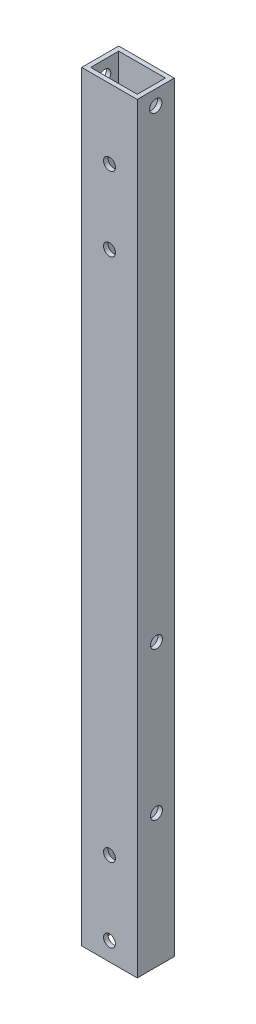
ISO-10303-21;
HEADER;
FILE_DESCRIPTION(('STEP AP214'),'2;1');
FILE_NAME('part.step','',(''),(''),'','','');
FILE_SCHEMA(('AUTOMOTIVE_DESIGN { 1 0 10303 214 1 1 1 1 }'));
ENDSEC;
DATA;
#1=APPLICATION_CONTEXT('core data for automotive mechanical design processes');
#2=APPLICATION_PROTOCOL_DEFINITION('international standard','automotive_design',2000,#1);
#3=PRODUCT_CONTEXT('',#1,'mechanical');
#4=PRODUCT('Part','Part','',(#3));
#5=PRODUCT_RELATED_PRODUCT_CATEGORY('part','',(#4));
#6=PRODUCT_DEFINITION_FORMATION('','',#4);
#7=PRODUCT_DEFINITION_CONTEXT('part definition',#1,'design');
#8=PRODUCT_DEFINITION('design','',#6,#7);
#9=PRODUCT_DEFINITION_SHAPE('','',#8);
#10=(LENGTH_UNIT() NAMED_UNIT(*) SI_UNIT(.MILLI.,.METRE.));
#11=(NAMED_UNIT(*) PLANE_ANGLE_UNIT() SI_UNIT($,.RADIAN.));
#12=(NAMED_UNIT(*) SI_UNIT($,.STERADIAN.) SOLID_ANGLE_UNIT());
#13=UNCERTAINTY_MEASURE_WITH_UNIT(LENGTH_MEASURE(1.E-05),#10,'distance_accuracy_value','');
#14=(GEOMETRIC_REPRESENTATION_CONTEXT(3) GLOBAL_UNCERTAINTY_ASSIGNED_CONTEXT((#13)) GLOBAL_UNIT_ASSIGNED_CONTEXT((#10,
#11,#12)) REPRESENTATION_CONTEXT('',''));
#15=CARTESIAN_POINT('',(0.,0.,0.));
#16=DIRECTION('',(0.,0.,1.));
#17=DIRECTION('',(1.,0.,0.));
#18=AXIS2_PLACEMENT_3D('',#15,#16,#17);
#19=CARTESIAN_POINT('',(7.5,110.,-5.));
#20=DIRECTION('',(-1.,0.,0.));
#21=DIRECTION('',(0.,0.,1.));
#22=AXIS2_PLACEMENT_3D('',#19,#20,#21);
#23=PLANE('',#22);
#24=CARTESIAN_POINT('',(7.5,91.5,0.));
#25=DIRECTION('',(-1.,0.,0.));
#26=DIRECTION('',(0.,0.,1.));
#27=AXIS2_PLACEMENT_3D('',#24,#25,#26);
#28=CIRCLE('',#27,1.65);
#29=CARTESIAN_POINT('',(7.5,91.5,1.64999999999995));
#30=VERTEX_POINT('',#29);
#31=EDGE_CURVE('E377',#30,#30,#28,.T.);
#32=ORIENTED_EDGE('',*,*,#31,.T.);
#33=EDGE_LOOP('',(#32));
#34=FACE_BOUND('',#33,.T.);
#35=CARTESIAN_POINT('',(7.5,-34.,-0.200000000000043));
#36=DIRECTION('',(-1.,0.,0.));
#37=DIRECTION('',(0.,0.,1.));
#38=AXIS2_PLACEMENT_3D('',#35,#36,#37);
#39=CIRCLE('',#38,1.6);
#40=CARTESIAN_POINT('',(7.5,-34.,1.39999999999995));
#41=VERTEX_POINT('',#40);
#42=EDGE_CURVE('E219',#41,#41,#39,.T.);
#43=ORIENTED_EDGE('',*,*,#42,.T.);
#44=EDGE_LOOP('',(#43));
#45=FACE_BOUND('',#44,.T.);
#46=CARTESIAN_POINT('',(7.5,-74.,-0.20000000000002));
#47=DIRECTION('',(-1.,0.,0.));
#48=DIRECTION('',(0.,0.,1.));
#49=AXIS2_PLACEMENT_3D('',#46,#47,#48);
#50=CIRCLE('',#49,1.60000000000001);
#51=CARTESIAN_POINT('',(7.5,-74.,1.39999999999999));
#52=VERTEX_POINT('',#51);
#53=EDGE_CURVE('E163',#52,#52,#50,.T.);
#54=ORIENTED_EDGE('',*,*,#53,.T.);
#55=EDGE_LOOP('',(#54));
#56=FACE_BOUND('',#55,.T.);
#57=DIRECTION('',(0.,0.,-1.));
#58=VECTOR('',#57,1.);
#59=CARTESIAN_POINT('',(7.5,95.5,5.));
#60=LINE('',#59,#58);
#61=CARTESIAN_POINT('',(7.5,95.5,5.));
#62=VERTEX_POINT('',#61);
#63=CARTESIAN_POINT('',(7.5,95.5,-5.));
#64=VERTEX_POINT('',#63);
#65=EDGE_CURVE('E111',#62,#64,#60,.T.);
#66=ORIENTED_EDGE('',*,*,#65,.F.);
#67=DIRECTION('',(0.,-1.,0.));
#68=VECTOR('',#67,1.);
#69=CARTESIAN_POINT('',(7.5,110.,5.));
#70=LINE('',#69,#68);
#71=CARTESIAN_POINT('',(7.5,-110.,5.));
#72=VERTEX_POINT('',#71);
#73=EDGE_CURVE('E122',#62,#72,#70,.T.);
#74=ORIENTED_EDGE('',*,*,#73,.T.);
#75=DIRECTION('',(0.,0.,-1.));
#76=VECTOR('',#75,1.);
#77=CARTESIAN_POINT('',(7.5,-110.,-5.));
#78=LINE('',#77,#76);
#79=CARTESIAN_POINT('',(7.5,-110.,-5.));
#80=VERTEX_POINT('',#79);
#81=EDGE_CURVE('E280',#72,#80,#78,.T.);
#82=ORIENTED_EDGE('',*,*,#81,.T.);
#83=DIRECTION('',(0.,-1.,0.));
#84=VECTOR('',#83,1.);
#85=CARTESIAN_POINT('',(7.5,110.,-5.));
#86=LINE('',#85,#84);
#87=EDGE_CURVE('E54',#64,#80,#86,.T.);
#88=ORIENTED_EDGE('',*,*,#87,.F.);
#89=EDGE_LOOP('',(#66,#74,#82,#88));
#90=FACE_BOUND('',#89,.T.);
#91=ADVANCED_FACE('F45',(#34,#45,#56,#90),#23,.F.);
#92=CARTESIAN_POINT('',(-7.5,110.,-5.));
#93=DIRECTION('',(0.,0.,1.));
#94=DIRECTION('',(1.,0.,0.));
#95=AXIS2_PLACEMENT_3D('',#92,#93,#94);
#96=PLANE('',#95);
#97=CARTESIAN_POINT('',(0.,56.66,-5.));
#98=DIRECTION('',(0.,0.,-1.));
#99=DIRECTION('',(-1.,0.,0.));
#100=AXIS2_PLACEMENT_3D('',#97,#98,#99);
#101=CIRCLE('',#100,1.6);
#102=CARTESIAN_POINT('',(-1.6,56.66,-5.));
#103=VERTEX_POINT('',#102);
#104=EDGE_CURVE('E173',#103,#103,#101,.T.);
#105=ORIENTED_EDGE('',*,*,#104,.F.);
#106=EDGE_LOOP('',(#105));
#107=FACE_BOUND('',#106,.T.);
#108=CARTESIAN_POINT('',(0.,76.66,-5.));
#109=DIRECTION('',(0.,0.,-1.));
#110=DIRECTION('',(-1.,0.,0.));
#111=AXIS2_PLACEMENT_3D('',#108,#109,#110);
#112=CIRCLE('',#111,1.6);
#113=CARTESIAN_POINT('',(-1.6,76.66,-5.));
#114=VERTEX_POINT('',#113);
#115=EDGE_CURVE('E390',#114,#114,#112,.T.);
#116=ORIENTED_EDGE('',*,*,#115,.F.);
#117=EDGE_LOOP('',(#116));
#118=FACE_BOUND('',#117,.T.);
#119=CARTESIAN_POINT('',(0.,-105.,-5.));
#120=DIRECTION('',(0.,0.,-1.));
#121=DIRECTION('',(-1.,0.,0.));
#122=AXIS2_PLACEMENT_3D('',#119,#120,#121);
#123=CIRCLE('',#122,1.60000000000001);
#124=CARTESIAN_POINT('',(-1.60000000000001,-105.,-5.));
#125=VERTEX_POINT('',#124);
#126=EDGE_CURVE('E232',#125,#125,#123,.T.);
#127=ORIENTED_EDGE('',*,*,#126,.F.);
#128=EDGE_LOOP('',(#127));
#129=FACE_BOUND('',#128,.T.);
#130=CARTESIAN_POINT('',(0.,-85.,-5.));
#131=DIRECTION('',(0.,0.,-1.));
#132=DIRECTION('',(-1.,0.,0.));
#133=AXIS2_PLACEMENT_3D('',#130,#131,#132);
#134=CIRCLE('',#133,1.6);
#135=CARTESIAN_POINT('',(-1.6,-85.,-5.));
#136=VERTEX_POINT('',#135);
#137=EDGE_CURVE('E151',#136,#136,#134,.T.);
#138=ORIENTED_EDGE('',*,*,#137,.F.);
#139=EDGE_LOOP('',(#138));
#140=FACE_BOUND('',#139,.T.);
#141=DIRECTION('',(-1.,0.,0.));
#142=VECTOR('',#141,1.);
#143=CARTESIAN_POINT('',(7.5,95.5,-5.));
#144=LINE('',#143,#142);
#145=CARTESIAN_POINT('',(-7.5,95.5,-5.));
#146=VERTEX_POINT('',#145);
#147=EDGE_CURVE('E125',#64,#146,#144,.T.);
#148=ORIENTED_EDGE('',*,*,#147,.F.);
#149=ORIENTED_EDGE('',*,*,#87,.T.);
#150=DIRECTION('',(-1.,0.,0.));
#151=VECTOR('',#150,1.);
#152=CARTESIAN_POINT('',(-7.5,-110.,-5.));
#153=LINE('',#152,#151);
#154=CARTESIAN_POINT('',(-7.5,-110.,-5.));
#155=VERTEX_POINT('',#154);
#156=EDGE_CURVE('E283',#80,#155,#153,.T.);
#157=ORIENTED_EDGE('',*,*,#156,.T.);
#158=DIRECTION('',(0.,-1.,0.));
#159=VECTOR('',#158,1.);
#160=CARTESIAN_POINT('',(-7.5,110.,-5.));
#161=LINE('',#160,#159);
#162=EDGE_CURVE('E136',#146,#155,#161,.T.);
#163=ORIENTED_EDGE('',*,*,#162,.F.);
#164=EDGE_LOOP('',(#148,#149,#157,#163));
#165=FACE_BOUND('',#164,.T.);
#166=ADVANCED_FACE('F297',(#107,#118,#129,#140,#165),#96,.F.);
#167=CARTESIAN_POINT('',(-7.5,110.,-5.));
#168=DIRECTION('',(1.,0.,0.));
#169=DIRECTION('',(0.,0.,-1.));
#170=AXIS2_PLACEMENT_3D('',#167,#168,#169);
#171=PLANE('',#170);
#172=CARTESIAN_POINT('',(-7.5,91.5,0.));
#173=DIRECTION('',(-1.,0.,0.));
#174=DIRECTION('',(0.,0.,1.));
#175=AXIS2_PLACEMENT_3D('',#172,#173,#174);
#176=CIRCLE('',#175,1.65);
#177=CARTESIAN_POINT('',(-7.5,91.5,1.64999999999995));
#178=VERTEX_POINT('',#177);
#179=EDGE_CURVE('E379',#178,#178,#176,.T.);
#180=ORIENTED_EDGE('',*,*,#179,.F.);
#181=EDGE_LOOP('',(#180));
#182=FACE_BOUND('',#181,.T.);
#183=CARTESIAN_POINT('',(-7.5,-34.,-0.200000000000042));
#184=DIRECTION('',(-1.,0.,0.));
#185=DIRECTION('',(0.,0.,1.));
#186=AXIS2_PLACEMENT_3D('',#183,#184,#185);
#187=CIRCLE('',#186,1.6);
#188=CARTESIAN_POINT('',(-7.5,-34.,1.39999999999995));
#189=VERTEX_POINT('',#188);
#190=EDGE_CURVE('E211',#189,#189,#187,.T.);
#191=ORIENTED_EDGE('',*,*,#190,.F.);
#192=EDGE_LOOP('',(#191));
#193=FACE_BOUND('',#192,.T.);
#194=CARTESIAN_POINT('',(-7.5,-74.,-0.200000000000019));
#195=DIRECTION('',(-1.,0.,0.));
#196=DIRECTION('',(0.,0.,1.));
#197=AXIS2_PLACEMENT_3D('',#194,#195,#196);
#198=CIRCLE('',#197,1.60000000000001);
#199=CARTESIAN_POINT('',(-7.5,-74.,1.39999999999999));
#200=VERTEX_POINT('',#199);
#201=EDGE_CURVE('E215',#200,#200,#198,.T.);
#202=ORIENTED_EDGE('',*,*,#201,.F.);
#203=EDGE_LOOP('',(#202));
#204=FACE_BOUND('',#203,.T.);
#205=DIRECTION('',(0.,0.,1.));
#206=VECTOR('',#205,1.);
#207=CARTESIAN_POINT('',(-7.5,95.5,-5.));
#208=LINE('',#207,#206);
#209=CARTESIAN_POINT('',(-7.5,95.5,5.));
#210=VERTEX_POINT('',#209);
#211=EDGE_CURVE('E62',#146,#210,#208,.T.);
#212=ORIENTED_EDGE('',*,*,#211,.F.);
#213=ORIENTED_EDGE('',*,*,#162,.T.);
#214=DIRECTION('',(0.,0.,1.));
#215=VECTOR('',#214,1.);
#216=CARTESIAN_POINT('',(-7.5,-110.,-5.));
#217=LINE('',#216,#215);
#218=CARTESIAN_POINT('',(-7.5,-110.,5.));
#219=VERTEX_POINT('',#218);
#220=EDGE_CURVE('E138',#155,#219,#217,.T.);
#221=ORIENTED_EDGE('',*,*,#220,.T.);
#222=DIRECTION('',(0.,-1.,0.));
#223=VECTOR('',#222,1.);
#224=CARTESIAN_POINT('',(-7.5,110.,5.));
#225=LINE('',#224,#223);
#226=EDGE_CURVE('E132',#210,#219,#225,.T.);
#227=ORIENTED_EDGE('',*,*,#226,.F.);
#228=EDGE_LOOP('',(#212,#213,#221,#227));
#229=FACE_BOUND('',#228,.T.);
#230=ADVANCED_FACE('F290',(#182,#193,#204,#229),#171,.F.);
#231=CARTESIAN_POINT('',(-7.5,110.,5.));
#232=DIRECTION('',(0.,0.,-1.));
#233=DIRECTION('',(-1.,0.,0.));
#234=AXIS2_PLACEMENT_3D('',#231,#232,#233);
#235=PLANE('',#234);
#236=CARTESIAN_POINT('',(0.,56.66,5.));
#237=DIRECTION('',(0.,0.,-1.));
#238=DIRECTION('',(-1.,0.,0.));
#239=AXIS2_PLACEMENT_3D('',#236,#237,#238);
#240=CIRCLE('',#239,1.6);
#241=CARTESIAN_POINT('',(-1.6,56.66,5.));
#242=VERTEX_POINT('',#241);
#243=EDGE_CURVE('E117',#242,#242,#240,.T.);
#244=ORIENTED_EDGE('',*,*,#243,.T.);
#245=EDGE_LOOP('',(#244));
#246=FACE_BOUND('',#245,.T.);
#247=CARTESIAN_POINT('',(0.,76.66,5.));
#248=DIRECTION('',(0.,0.,-1.));
#249=DIRECTION('',(-1.,0.,0.));
#250=AXIS2_PLACEMENT_3D('',#247,#248,#249);
#251=CIRCLE('',#250,1.6);
#252=CARTESIAN_POINT('',(-1.6,76.66,5.));
#253=VERTEX_POINT('',#252);
#254=EDGE_CURVE('E178',#253,#253,#251,.T.);
#255=ORIENTED_EDGE('',*,*,#254,.T.);
#256=EDGE_LOOP('',(#255));
#257=FACE_BOUND('',#256,.T.);
#258=CARTESIAN_POINT('',(0.,-105.,5.));
#259=DIRECTION('',(0.,0.,-1.));
#260=DIRECTION('',(-1.,0.,0.));
#261=AXIS2_PLACEMENT_3D('',#258,#259,#260);
#262=CIRCLE('',#261,1.60000000000001);
#263=CARTESIAN_POINT('',(-1.60000000000001,-105.,5.));
#264=VERTEX_POINT('',#263);
#265=EDGE_CURVE('E157',#264,#264,#262,.T.);
#266=ORIENTED_EDGE('',*,*,#265,.T.);
#267=EDGE_LOOP('',(#266));
#268=FACE_BOUND('',#267,.T.);
#269=CARTESIAN_POINT('',(0.,-85.,5.));
#270=DIRECTION('',(0.,0.,-1.));
#271=DIRECTION('',(-1.,0.,0.));
#272=AXIS2_PLACEMENT_3D('',#269,#270,#271);
#273=CIRCLE('',#272,1.6);
#274=CARTESIAN_POINT('',(-1.6,-85.,5.));
#275=VERTEX_POINT('',#274);
#276=EDGE_CURVE('E248',#275,#275,#273,.T.);
#277=ORIENTED_EDGE('',*,*,#276,.T.);
#278=EDGE_LOOP('',(#277));
#279=FACE_BOUND('',#278,.T.);
#280=DIRECTION('',(1.,0.,0.));
#281=VECTOR('',#280,1.);
#282=CARTESIAN_POINT('',(-7.5,95.5,5.));
#283=LINE('',#282,#281);
#284=EDGE_CURVE('E108',#210,#62,#283,.T.);
#285=ORIENTED_EDGE('',*,*,#284,.F.);
#286=ORIENTED_EDGE('',*,*,#226,.T.);
#287=DIRECTION('',(1.,0.,0.));
#288=VECTOR('',#287,1.);
#289=CARTESIAN_POINT('',(-7.5,-110.,5.));
#290=LINE('',#289,#288);
#291=EDGE_CURVE('E129',#219,#72,#290,.T.);
#292=ORIENTED_EDGE('',*,*,#291,.T.);
#293=ORIENTED_EDGE('',*,*,#73,.F.);
#294=EDGE_LOOP('',(#285,#286,#292,#293));
#295=FACE_BOUND('',#294,.T.);
#296=ADVANCED_FACE('F127',(#246,#257,#268,#279,#295),#235,.F.);
#297=CARTESIAN_POINT('',(-6.3,110.,-3.8));
#298=DIRECTION('',(1.,0.,0.));
#299=DIRECTION('',(0.,0.,-1.));
#300=AXIS2_PLACEMENT_3D('',#297,#298,#299);
#301=PLANE('',#300);
#302=CARTESIAN_POINT('',(-6.3,91.5,0.));
#303=DIRECTION('',(1.,0.,0.));
#304=DIRECTION('',(0.,0.,-1.));
#305=AXIS2_PLACEMENT_3D('',#302,#303,#304);
#306=CIRCLE('',#305,1.65);
#307=CARTESIAN_POINT('',(-6.3,91.5,-1.65000000000005));
#308=VERTEX_POINT('',#307);
#309=EDGE_CURVE('E383',#308,#308,#306,.T.);
#310=ORIENTED_EDGE('',*,*,#309,.F.);
#311=EDGE_LOOP('',(#310));
#312=FACE_BOUND('',#311,.T.);
#313=CARTESIAN_POINT('',(-6.3,-74.,-0.200000000000019));
#314=DIRECTION('',(1.,0.,0.));
#315=DIRECTION('',(0.,0.,-1.));
#316=AXIS2_PLACEMENT_3D('',#313,#314,#315);
#317=CIRCLE('',#316,1.60000000000001);
#318=CARTESIAN_POINT('',(-6.3,-74.,-1.80000000000003));
#319=VERTEX_POINT('',#318);
#320=EDGE_CURVE('E167',#319,#319,#317,.T.);
#321=ORIENTED_EDGE('',*,*,#320,.F.);
#322=EDGE_LOOP('',(#321));
#323=FACE_BOUND('',#322,.T.);
#324=CARTESIAN_POINT('',(-6.3,-34.,-0.200000000000042));
#325=DIRECTION('',(1.,0.,0.));
#326=DIRECTION('',(0.,0.,-1.));
#327=AXIS2_PLACEMENT_3D('',#324,#325,#326);
#328=CIRCLE('',#327,1.6);
#329=CARTESIAN_POINT('',(-6.3,-34.,-1.80000000000004));
#330=VERTEX_POINT('',#329);
#331=EDGE_CURVE('E162',#330,#330,#328,.T.);
#332=ORIENTED_EDGE('',*,*,#331,.F.);
#333=EDGE_LOOP('',(#332));
#334=FACE_BOUND('',#333,.T.);
#335=DIRECTION('',(0.,-1.,0.));
#336=VECTOR('',#335,1.);
#337=CARTESIAN_POINT('',(-6.3,110.,-3.8));
#338=LINE('',#337,#336);
#339=CARTESIAN_POINT('',(-6.3,95.5,-3.8));
#340=VERTEX_POINT('',#339);
#341=CARTESIAN_POINT('',(-6.3,-110.,-3.8));
#342=VERTEX_POINT('',#341);
#343=EDGE_CURVE('E268',#340,#342,#338,.T.);
#344=ORIENTED_EDGE('',*,*,#343,.F.);
#345=DIRECTION('',(0.,0.,1.));
#346=VECTOR('',#345,1.);
#347=CARTESIAN_POINT('',(-6.3,95.5,-3.8));
#348=LINE('',#347,#346);
#349=CARTESIAN_POINT('',(-6.3,95.5,3.8));
#350=VERTEX_POINT('',#349);
#351=EDGE_CURVE('E70',#340,#350,#348,.T.);
#352=ORIENTED_EDGE('',*,*,#351,.T.);
#353=DIRECTION('',(0.,-1.,0.));
#354=VECTOR('',#353,1.);
#355=CARTESIAN_POINT('',(-6.3,110.,3.8));
#356=LINE('',#355,#354);
#357=CARTESIAN_POINT('',(-6.3,-110.,3.8));
#358=VERTEX_POINT('',#357);
#359=EDGE_CURVE('E277',#350,#358,#356,.T.);
#360=ORIENTED_EDGE('',*,*,#359,.T.);
#361=DIRECTION('',(0.,0.,1.));
#362=VECTOR('',#361,1.);
#363=CARTESIAN_POINT('',(-6.3,-110.,-3.8));
#364=LINE('',#363,#362);
#365=EDGE_CURVE('E252',#342,#358,#364,.T.);
#366=ORIENTED_EDGE('',*,*,#365,.F.);
#367=EDGE_LOOP('',(#344,#352,#360,#366));
#368=FACE_BOUND('',#367,.T.);
#369=ADVANCED_FACE('F313',(#312,#323,#334,#368),#301,.T.);
#370=CARTESIAN_POINT('',(-6.3,110.,3.8));
#371=DIRECTION('',(0.,0.,-1.));
#372=DIRECTION('',(-1.,0.,0.));
#373=AXIS2_PLACEMENT_3D('',#370,#371,#372);
#374=PLANE('',#373);
#375=CARTESIAN_POINT('',(0.,56.66,3.8));
#376=DIRECTION('',(0.,0.,-1.));
#377=DIRECTION('',(-1.,0.,0.));
#378=AXIS2_PLACEMENT_3D('',#375,#376,#377);
#379=CIRCLE('',#378,1.6);
#380=CARTESIAN_POINT('',(-1.6,56.66,3.8));
#381=VERTEX_POINT('',#380);
#382=EDGE_CURVE('E177',#381,#381,#379,.T.);
#383=ORIENTED_EDGE('',*,*,#382,.F.);
#384=EDGE_LOOP('',(#383));
#385=FACE_BOUND('',#384,.T.);
#386=CARTESIAN_POINT('',(0.,76.66,3.8));
#387=DIRECTION('',(0.,0.,-1.));
#388=DIRECTION('',(-1.,0.,0.));
#389=AXIS2_PLACEMENT_3D('',#386,#387,#388);
#390=CIRCLE('',#389,1.6);
#391=CARTESIAN_POINT('',(-1.6,76.66,3.8));
#392=VERTEX_POINT('',#391);
#393=EDGE_CURVE('E172',#392,#392,#390,.T.);
#394=ORIENTED_EDGE('',*,*,#393,.F.);
#395=EDGE_LOOP('',(#394));
#396=FACE_BOUND('',#395,.T.);
#397=CARTESIAN_POINT('',(0.,-85.,3.8));
#398=DIRECTION('',(0.,0.,-1.));
#399=DIRECTION('',(-1.,0.,0.));
#400=AXIS2_PLACEMENT_3D('',#397,#398,#399);
#401=CIRCLE('',#400,1.6);
#402=CARTESIAN_POINT('',(-1.6,-85.,3.8));
#403=VERTEX_POINT('',#402);
#404=EDGE_CURVE('E156',#403,#403,#401,.T.);
#405=ORIENTED_EDGE('',*,*,#404,.F.);
#406=EDGE_LOOP('',(#405));
#407=FACE_BOUND('',#406,.T.);
#408=CARTESIAN_POINT('',(0.,-105.,3.8));
#409=DIRECTION('',(0.,0.,-1.));
#410=DIRECTION('',(-1.,0.,0.));
#411=AXIS2_PLACEMENT_3D('',#408,#409,#410);
#412=CIRCLE('',#411,1.60000000000001);
#413=CARTESIAN_POINT('',(-1.60000000000001,-105.,3.8));
#414=VERTEX_POINT('',#413);
#415=EDGE_CURVE('E150',#414,#414,#412,.T.);
#416=ORIENTED_EDGE('',*,*,#415,.F.);
#417=EDGE_LOOP('',(#416));
#418=FACE_BOUND('',#417,.T.);
#419=ORIENTED_EDGE('',*,*,#359,.F.);
#420=DIRECTION('',(1.,0.,0.));
#421=VECTOR('',#420,1.);
#422=CARTESIAN_POINT('',(-6.3,95.5,3.8));
#423=LINE('',#422,#421);
#424=CARTESIAN_POINT('',(6.3,95.5,3.8));
#425=VERTEX_POINT('',#424);
#426=EDGE_CURVE('E205',#350,#425,#423,.T.);
#427=ORIENTED_EDGE('',*,*,#426,.T.);
#428=DIRECTION('',(0.,-1.,0.));
#429=VECTOR('',#428,1.);
#430=CARTESIAN_POINT('',(6.3,110.,3.8));
#431=LINE('',#430,#429);
#432=CARTESIAN_POINT('',(6.3,-110.,3.8));
#433=VERTEX_POINT('',#432);
#434=EDGE_CURVE('E274',#425,#433,#431,.T.);
#435=ORIENTED_EDGE('',*,*,#434,.T.);
#436=DIRECTION('',(1.,0.,0.));
#437=VECTOR('',#436,1.);
#438=CARTESIAN_POINT('',(-6.3,-110.,3.8));
#439=LINE('',#438,#437);
#440=EDGE_CURVE('E256',#358,#433,#439,.T.);
#441=ORIENTED_EDGE('',*,*,#440,.F.);
#442=EDGE_LOOP('',(#419,#427,#435,#441));
#443=FACE_BOUND('',#442,.T.);
#444=ADVANCED_FACE('F321',(#385,#396,#407,#418,#443),#374,.T.);
#445=CARTESIAN_POINT('',(6.3,110.,-3.8));
#446=DIRECTION('',(-1.,0.,0.));
#447=DIRECTION('',(0.,0.,1.));
#448=AXIS2_PLACEMENT_3D('',#445,#446,#447);
#449=PLANE('',#448);
#450=CARTESIAN_POINT('',(6.3,91.5,0.));
#451=DIRECTION('',(-1.,0.,0.));
#452=DIRECTION('',(0.,0.,1.));
#453=AXIS2_PLACEMENT_3D('',#450,#451,#452);
#454=CIRCLE('',#453,1.65);
#455=CARTESIAN_POINT('',(6.3,91.5,1.64999999999995));
#456=VERTEX_POINT('',#455);
#457=EDGE_CURVE('E48',#456,#456,#454,.T.);
#458=ORIENTED_EDGE('',*,*,#457,.F.);
#459=EDGE_LOOP('',(#458));
#460=FACE_BOUND('',#459,.T.);
#461=CARTESIAN_POINT('',(6.3,-74.,-0.20000000000002));
#462=DIRECTION('',(-1.,0.,0.));
#463=DIRECTION('',(0.,0.,1.));
#464=AXIS2_PLACEMENT_3D('',#461,#462,#463);
#465=CIRCLE('',#464,1.60000000000001);
#466=CARTESIAN_POINT('',(6.3,-74.,1.39999999999999));
#467=VERTEX_POINT('',#466);
#468=EDGE_CURVE('E164',#467,#467,#465,.T.);
#469=ORIENTED_EDGE('',*,*,#468,.F.);
#470=EDGE_LOOP('',(#469));
#471=FACE_BOUND('',#470,.T.);
#472=CARTESIAN_POINT('',(6.3,-34.,-0.200000000000043));
#473=DIRECTION('',(-1.,0.,0.));
#474=DIRECTION('',(0.,0.,1.));
#475=AXIS2_PLACEMENT_3D('',#472,#473,#474);
#476=CIRCLE('',#475,1.6);
#477=CARTESIAN_POINT('',(6.3,-34.,1.39999999999995));
#478=VERTEX_POINT('',#477);
#479=EDGE_CURVE('E158',#478,#478,#476,.T.);
#480=ORIENTED_EDGE('',*,*,#479,.F.);
#481=EDGE_LOOP('',(#480));
#482=FACE_BOUND('',#481,.T.);
#483=ORIENTED_EDGE('',*,*,#434,.F.);
#484=DIRECTION('',(0.,0.,-1.));
#485=VECTOR('',#484,1.);
#486=CARTESIAN_POINT('',(6.3,95.5,-3.8));
#487=LINE('',#486,#485);
#488=CARTESIAN_POINT('',(6.3,95.5,-3.8));
#489=VERTEX_POINT('',#488);
#490=EDGE_CURVE('E201',#425,#489,#487,.T.);
#491=ORIENTED_EDGE('',*,*,#490,.T.);
#492=DIRECTION('',(0.,-1.,0.));
#493=VECTOR('',#492,1.);
#494=CARTESIAN_POINT('',(6.3,110.,-3.8));
#495=LINE('',#494,#493);
#496=CARTESIAN_POINT('',(6.3,-110.,-3.8));
#497=VERTEX_POINT('',#496);
#498=EDGE_CURVE('E271',#489,#497,#495,.T.);
#499=ORIENTED_EDGE('',*,*,#498,.T.);
#500=DIRECTION('',(0.,0.,-1.));
#501=VECTOR('',#500,1.);
#502=CARTESIAN_POINT('',(6.3,-110.,-3.8));
#503=LINE('',#502,#501);
#504=EDGE_CURVE('E260',#433,#497,#503,.T.);
#505=ORIENTED_EDGE('',*,*,#504,.F.);
#506=EDGE_LOOP('',(#483,#491,#499,#505));
#507=FACE_BOUND('',#506,.T.);
#508=ADVANCED_FACE('F325',(#460,#471,#482,#507),#449,.T.);
#509=CARTESIAN_POINT('',(-6.3,110.,-3.8));
#510=DIRECTION('',(0.,0.,1.));
#511=DIRECTION('',(1.,0.,0.));
#512=AXIS2_PLACEMENT_3D('',#509,#510,#511);
#513=PLANE('',#512);
#514=CARTESIAN_POINT('',(0.,56.66,-3.8));
#515=DIRECTION('',(0.,0.,1.));
#516=DIRECTION('',(1.,0.,0.));
#517=AXIS2_PLACEMENT_3D('',#514,#515,#516);
#518=CIRCLE('',#517,1.6);
#519=CARTESIAN_POINT('',(1.6,56.66,-3.8));
#520=VERTEX_POINT('',#519);
#521=EDGE_CURVE('E174',#520,#520,#518,.T.);
#522=ORIENTED_EDGE('',*,*,#521,.F.);
#523=EDGE_LOOP('',(#522));
#524=FACE_BOUND('',#523,.T.);
#525=CARTESIAN_POINT('',(0.,76.66,-3.8));
#526=DIRECTION('',(0.,0.,1.));
#527=DIRECTION('',(1.,0.,0.));
#528=AXIS2_PLACEMENT_3D('',#525,#526,#527);
#529=CIRCLE('',#528,1.6);
#530=CARTESIAN_POINT('',(1.6,76.66,-3.8));
#531=VERTEX_POINT('',#530);
#532=EDGE_CURVE('E169',#531,#531,#529,.T.);
#533=ORIENTED_EDGE('',*,*,#532,.F.);
#534=EDGE_LOOP('',(#533));
#535=FACE_BOUND('',#534,.T.);
#536=CARTESIAN_POINT('',(0.,-85.,-3.8));
#537=DIRECTION('',(0.,0.,1.));
#538=DIRECTION('',(1.,0.,0.));
#539=AXIS2_PLACEMENT_3D('',#536,#537,#538);
#540=CIRCLE('',#539,1.6);
#541=CARTESIAN_POINT('',(1.6,-85.,-3.8));
#542=VERTEX_POINT('',#541);
#543=EDGE_CURVE('E152',#542,#542,#540,.T.);
#544=ORIENTED_EDGE('',*,*,#543,.F.);
#545=EDGE_LOOP('',(#544));
#546=FACE_BOUND('',#545,.T.);
#547=CARTESIAN_POINT('',(0.,-105.,-3.8));
#548=DIRECTION('',(0.,0.,1.));
#549=DIRECTION('',(1.,0.,0.));
#550=AXIS2_PLACEMENT_3D('',#547,#548,#549);
#551=CIRCLE('',#550,1.60000000000001);
#552=CARTESIAN_POINT('',(1.60000000000001,-105.,-3.8));
#553=VERTEX_POINT('',#552);
#554=EDGE_CURVE('E146',#553,#553,#551,.T.);
#555=ORIENTED_EDGE('',*,*,#554,.F.);
#556=EDGE_LOOP('',(#555));
#557=FACE_BOUND('',#556,.T.);
#558=ORIENTED_EDGE('',*,*,#498,.F.);
#559=DIRECTION('',(-1.,0.,0.));
#560=VECTOR('',#559,1.);
#561=CARTESIAN_POINT('',(-6.3,95.5,-3.8));
#562=LINE('',#561,#560);
#563=EDGE_CURVE('E11',#489,#340,#562,.T.);
#564=ORIENTED_EDGE('',*,*,#563,.T.);
#565=ORIENTED_EDGE('',*,*,#343,.T.);
#566=DIRECTION('',(-1.,0.,0.));
#567=VECTOR('',#566,1.);
#568=CARTESIAN_POINT('',(-6.3,-110.,-3.8));
#569=LINE('',#568,#567);
#570=EDGE_CURVE('E264',#497,#342,#569,.T.);
#571=ORIENTED_EDGE('',*,*,#570,.F.);
#572=EDGE_LOOP('',(#558,#564,#565,#571));
#573=FACE_BOUND('',#572,.T.);
#574=ADVANCED_FACE('F318',(#524,#535,#546,#557,#573),#513,.T.);
#575=CARTESIAN_POINT('',(0.,-110.,0.));
#576=DIRECTION('',(0.,1.,0.));
#577=DIRECTION('',(0.,0.,1.));
#578=AXIS2_PLACEMENT_3D('',#575,#576,#577);
#579=PLANE('',#578);
#580=ORIENTED_EDGE('',*,*,#81,.F.);
#581=ORIENTED_EDGE('',*,*,#291,.F.);
#582=ORIENTED_EDGE('',*,*,#220,.F.);
#583=ORIENTED_EDGE('',*,*,#156,.F.);
#584=EDGE_LOOP('',(#580,#581,#582,#583));
#585=FACE_BOUND('',#584,.T.);
#586=ORIENTED_EDGE('',*,*,#365,.T.);
#587=ORIENTED_EDGE('',*,*,#440,.T.);
#588=ORIENTED_EDGE('',*,*,#504,.T.);
#589=ORIENTED_EDGE('',*,*,#570,.T.);
#590=EDGE_LOOP('',(#586,#587,#588,#589));
#591=FACE_BOUND('',#590,.T.);
#592=ADVANCED_FACE('F294',(#585,#591),#579,.F.);
#593=CARTESIAN_POINT('',(0.,-105.,95.));
#594=DIRECTION('',(0.,0.,-1.));
#595=DIRECTION('',(-1.,0.,0.));
#596=AXIS2_PLACEMENT_3D('',#593,#594,#595);
#597=CYLINDRICAL_SURFACE('',#596,1.60000000000001);
#598=ORIENTED_EDGE('',*,*,#554,.T.);
#599=EDGE_LOOP('',(#598));
#600=FACE_BOUND('',#599,.T.);
#601=ORIENTED_EDGE('',*,*,#126,.T.);
#602=EDGE_LOOP('',(#601));
#603=FACE_BOUND('',#602,.T.);
#604=ADVANCED_FACE('F317',(#600,#603),#597,.F.);
#605=CARTESIAN_POINT('',(0.,-85.,95.));
#606=DIRECTION('',(0.,0.,-1.));
#607=DIRECTION('',(-1.,0.,0.));
#608=AXIS2_PLACEMENT_3D('',#605,#606,#607);
#609=CYLINDRICAL_SURFACE('',#608,1.6);
#610=ORIENTED_EDGE('',*,*,#543,.T.);
#611=EDGE_LOOP('',(#610));
#612=FACE_BOUND('',#611,.T.);
#613=ORIENTED_EDGE('',*,*,#137,.T.);
#614=EDGE_LOOP('',(#613));
#615=FACE_BOUND('',#614,.T.);
#616=ADVANCED_FACE('F335',(#612,#615),#609,.F.);
#617=ORIENTED_EDGE('',*,*,#415,.T.);
#618=EDGE_LOOP('',(#617));
#619=FACE_BOUND('',#618,.T.);
#620=ORIENTED_EDGE('',*,*,#265,.F.);
#621=EDGE_LOOP('',(#620));
#622=FACE_BOUND('',#621,.T.);
#623=ADVANCED_FACE('F337',(#619,#622),#597,.F.);
#624=ORIENTED_EDGE('',*,*,#404,.T.);
#625=EDGE_LOOP('',(#624));
#626=FACE_BOUND('',#625,.T.);
#627=ORIENTED_EDGE('',*,*,#276,.F.);
#628=EDGE_LOOP('',(#627));
#629=FACE_BOUND('',#628,.T.);
#630=ADVANCED_FACE('F341',(#626,#629),#609,.F.);
#631=CARTESIAN_POINT('',(7.5,-34.,-0.200000000000043));
#632=DIRECTION('',(-1.,0.,0.));
#633=DIRECTION('',(0.,0.,1.));
#634=AXIS2_PLACEMENT_3D('',#631,#632,#633);
#635=CYLINDRICAL_SURFACE('',#634,1.6);
#636=ORIENTED_EDGE('',*,*,#479,.T.);
#637=EDGE_LOOP('',(#636));
#638=FACE_BOUND('',#637,.T.);
#639=ORIENTED_EDGE('',*,*,#42,.F.);
#640=EDGE_LOOP('',(#639));
#641=FACE_BOUND('',#640,.T.);
#642=ADVANCED_FACE('F342',(#638,#641),#635,.F.);
#643=CARTESIAN_POINT('',(7.5,-74.,-0.20000000000002));
#644=DIRECTION('',(-1.,0.,0.));
#645=DIRECTION('',(0.,0.,1.));
#646=AXIS2_PLACEMENT_3D('',#643,#644,#645);
#647=CYLINDRICAL_SURFACE('',#646,1.60000000000001);
#648=ORIENTED_EDGE('',*,*,#468,.T.);
#649=EDGE_LOOP('',(#648));
#650=FACE_BOUND('',#649,.T.);
#651=ORIENTED_EDGE('',*,*,#53,.F.);
#652=EDGE_LOOP('',(#651));
#653=FACE_BOUND('',#652,.T.);
#654=ADVANCED_FACE('F345',(#650,#653),#647,.F.);
#655=ORIENTED_EDGE('',*,*,#331,.T.);
#656=EDGE_LOOP('',(#655));
#657=FACE_BOUND('',#656,.T.);
#658=ORIENTED_EDGE('',*,*,#190,.T.);
#659=EDGE_LOOP('',(#658));
#660=FACE_BOUND('',#659,.T.);
#661=ADVANCED_FACE('F347',(#657,#660),#635,.F.);
#662=ORIENTED_EDGE('',*,*,#320,.T.);
#663=EDGE_LOOP('',(#662));
#664=FACE_BOUND('',#663,.T.);
#665=ORIENTED_EDGE('',*,*,#201,.T.);
#666=EDGE_LOOP('',(#665));
#667=FACE_BOUND('',#666,.T.);
#668=ADVANCED_FACE('F351',(#664,#667),#647,.F.);
#669=CARTESIAN_POINT('',(0.,95.5,0.));
#670=DIRECTION('',(0.,1.,0.));
#671=DIRECTION('',(0.,0.,1.));
#672=AXIS2_PLACEMENT_3D('',#669,#670,#671);
#673=PLANE('',#672);
#674=ORIENTED_EDGE('',*,*,#563,.F.);
#675=ORIENTED_EDGE('',*,*,#490,.F.);
#676=ORIENTED_EDGE('',*,*,#426,.F.);
#677=ORIENTED_EDGE('',*,*,#351,.F.);
#678=EDGE_LOOP('',(#674,#675,#676,#677));
#679=FACE_BOUND('',#678,.T.);
#680=ORIENTED_EDGE('',*,*,#284,.T.);
#681=ORIENTED_EDGE('',*,*,#65,.T.);
#682=ORIENTED_EDGE('',*,*,#147,.T.);
#683=ORIENTED_EDGE('',*,*,#211,.T.);
#684=EDGE_LOOP('',(#680,#681,#682,#683));
#685=FACE_BOUND('',#684,.T.);
#686=ADVANCED_FACE('F110',(#679,#685),#673,.T.);
#687=CARTESIAN_POINT('',(0.,76.66,10.));
#688=DIRECTION('',(0.,0.,-1.));
#689=DIRECTION('',(-1.,0.,0.));
#690=AXIS2_PLACEMENT_3D('',#687,#688,#689);
#691=CYLINDRICAL_SURFACE('',#690,1.6);
#692=ORIENTED_EDGE('',*,*,#532,.T.);
#693=EDGE_LOOP('',(#692));
#694=FACE_BOUND('',#693,.T.);
#695=ORIENTED_EDGE('',*,*,#115,.T.);
#696=EDGE_LOOP('',(#695));
#697=FACE_BOUND('',#696,.T.);
#698=ADVANCED_FACE('F353',(#694,#697),#691,.F.);
#699=CARTESIAN_POINT('',(0.,56.66,10.));
#700=DIRECTION('',(0.,0.,-1.));
#701=DIRECTION('',(-1.,0.,0.));
#702=AXIS2_PLACEMENT_3D('',#699,#700,#701);
#703=CYLINDRICAL_SURFACE('',#702,1.6);
#704=ORIENTED_EDGE('',*,*,#521,.T.);
#705=EDGE_LOOP('',(#704));
#706=FACE_BOUND('',#705,.T.);
#707=ORIENTED_EDGE('',*,*,#104,.T.);
#708=EDGE_LOOP('',(#707));
#709=FACE_BOUND('',#708,.T.);
#710=ADVANCED_FACE('F356',(#706,#709),#703,.F.);
#711=ORIENTED_EDGE('',*,*,#393,.T.);
#712=EDGE_LOOP('',(#711));
#713=FACE_BOUND('',#712,.T.);
#714=ORIENTED_EDGE('',*,*,#254,.F.);
#715=EDGE_LOOP('',(#714));
#716=FACE_BOUND('',#715,.T.);
#717=ADVANCED_FACE('F358',(#713,#716),#691,.F.);
#718=ORIENTED_EDGE('',*,*,#382,.T.);
#719=EDGE_LOOP('',(#718));
#720=FACE_BOUND('',#719,.T.);
#721=ORIENTED_EDGE('',*,*,#243,.F.);
#722=EDGE_LOOP('',(#721));
#723=FACE_BOUND('',#722,.T.);
#724=ADVANCED_FACE('F361',(#720,#723),#703,.F.);
#725=CARTESIAN_POINT('',(7.5,91.5,0.));
#726=DIRECTION('',(-1.,0.,0.));
#727=DIRECTION('',(0.,0.,1.));
#728=AXIS2_PLACEMENT_3D('',#725,#726,#727);
#729=CYLINDRICAL_SURFACE('',#728,1.65);
#730=ORIENTED_EDGE('',*,*,#457,.T.);
#731=EDGE_LOOP('',(#730));
#732=FACE_BOUND('',#731,.T.);
#733=ORIENTED_EDGE('',*,*,#31,.F.);
#734=EDGE_LOOP('',(#733));
#735=FACE_BOUND('',#734,.T.);
#736=ADVANCED_FACE('F362',(#732,#735),#729,.F.);
#737=ORIENTED_EDGE('',*,*,#309,.T.);
#738=EDGE_LOOP('',(#737));
#739=FACE_BOUND('',#738,.T.);
#740=ORIENTED_EDGE('',*,*,#179,.T.);
#741=EDGE_LOOP('',(#740));
#742=FACE_BOUND('',#741,.T.);
#743=ADVANCED_FACE('F364',(#739,#742),#729,.F.);
#744=CLOSED_SHELL('',(#91,#166,#230,#296,#369,#444,#508,#574,#592,#604,#616,#623,#630,#642,#654,
#661,#668,#686,#698,#710,#717,#724,#736,#743));
#745=MANIFOLD_SOLID_BREP('B2',#744);
#746=ADVANCED_BREP_SHAPE_REPRESENTATION('',(#18,#745),#14);
#747=SHAPE_DEFINITION_REPRESENTATION(#9,#746);
ENDSEC;
END-ISO-10303-21;
